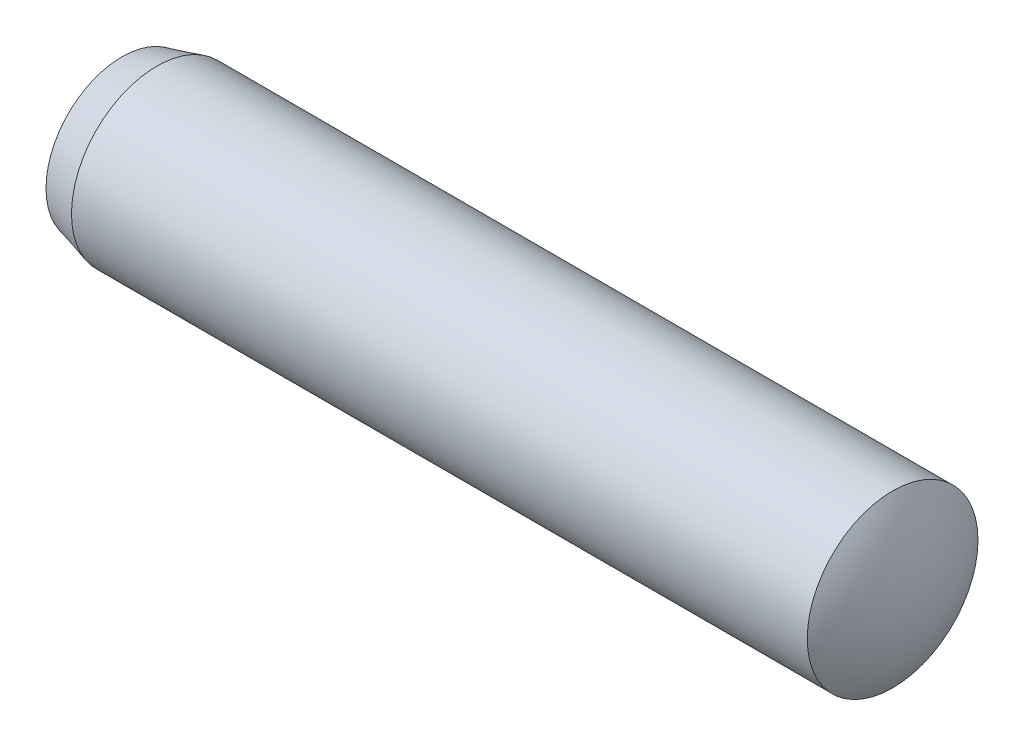
ISO-10303-21;
HEADER;
FILE_DESCRIPTION(('STEP AP214'),'2;1');
FILE_NAME('part.step','',(''),(''),'','','');
FILE_SCHEMA(('AUTOMOTIVE_DESIGN { 1 0 10303 214 1 1 1 1 }'));
ENDSEC;
DATA;
#1=APPLICATION_CONTEXT('core data for automotive mechanical design processes');
#2=APPLICATION_PROTOCOL_DEFINITION('international standard','automotive_design',2000,#1);
#3=PRODUCT_CONTEXT('',#1,'mechanical');
#4=PRODUCT('Part','Part','',(#3));
#5=PRODUCT_RELATED_PRODUCT_CATEGORY('part','',(#4));
#6=PRODUCT_DEFINITION_FORMATION('','',#4);
#7=PRODUCT_DEFINITION_CONTEXT('part definition',#1,'design');
#8=PRODUCT_DEFINITION('design','',#6,#7);
#9=PRODUCT_DEFINITION_SHAPE('','',#8);
#10=(LENGTH_UNIT() NAMED_UNIT(*) SI_UNIT(.MILLI.,.METRE.));
#11=(NAMED_UNIT(*) PLANE_ANGLE_UNIT() SI_UNIT($,.RADIAN.));
#12=(NAMED_UNIT(*) SI_UNIT($,.STERADIAN.) SOLID_ANGLE_UNIT());
#13=UNCERTAINTY_MEASURE_WITH_UNIT(LENGTH_MEASURE(1.E-05),#10,'distance_accuracy_value','');
#14=(GEOMETRIC_REPRESENTATION_CONTEXT(3) GLOBAL_UNCERTAINTY_ASSIGNED_CONTEXT((#13)) GLOBAL_UNIT_ASSIGNED_CONTEXT((#10,
#11,#12)) REPRESENTATION_CONTEXT('',''));
#15=CARTESIAN_POINT('',(0.,0.,0.));
#16=DIRECTION('',(0.,0.,1.));
#17=DIRECTION('',(1.,0.,0.));
#18=AXIS2_PLACEMENT_3D('',#15,#16,#17);
#19=CARTESIAN_POINT('',(-12.,0.,0.));
#20=DIRECTION('',(-1.,0.,0.));
#21=DIRECTION('',(0.,-1.,0.));
#22=AXIS2_PLACEMENT_3D('',#19,#20,#21);
#23=CYLINDRICAL_SURFACE('',#22,2.5);
#24=CARTESIAN_POINT('',(-10.3,0.,0.));
#25=DIRECTION('',(-1.,0.,0.));
#26=DIRECTION('',(0.,-1.,0.));
#27=AXIS2_PLACEMENT_3D('',#24,#25,#26);
#28=CIRCLE('',#27,2.5);
#29=CARTESIAN_POINT('',(-10.3,-2.5,0.));
#30=VERTEX_POINT('',#29);
#31=EDGE_CURVE('E10',#30,#30,#28,.T.);
#32=ORIENTED_EDGE('',*,*,#31,.F.);
#33=EDGE_LOOP('',(#32));
#34=FACE_BOUND('',#33,.T.);
#35=CARTESIAN_POINT('',(11.25,0.,0.));
#36=DIRECTION('',(-1.,0.,0.));
#37=DIRECTION('',(0.,-1.,0.));
#38=AXIS2_PLACEMENT_3D('',#35,#36,#37);
#39=CIRCLE('',#38,2.5);
#40=CARTESIAN_POINT('',(11.25,-2.49999999999999,0.));
#41=VERTEX_POINT('',#40);
#42=EDGE_CURVE('E53',#41,#41,#39,.T.);
#43=ORIENTED_EDGE('',*,*,#42,.T.);
#44=EDGE_LOOP('',(#43));
#45=FACE_BOUND('',#44,.T.);
#46=ADVANCED_FACE('F41',(#34,#45),#23,.T.);
#47=CARTESIAN_POINT('',(-10.3,0.,0.));
#48=DIRECTION('',(1.,0.,0.));
#49=DIRECTION('',(0.,1.,0.));
#50=AXIS2_PLACEMENT_3D('',#47,#48,#49);
#51=CONICAL_SURFACE('',#50,2.5,0.261799387799151);
#52=CARTESIAN_POINT('',(-11.32,0.,0.));
#53=DIRECTION('',(-1.,0.,0.));
#54=DIRECTION('',(0.,-1.,0.));
#55=AXIS2_PLACEMENT_3D('',#52,#53,#54);
#56=CIRCLE('',#55,2.22669182372025);
#57=CARTESIAN_POINT('',(-11.32,-2.22669182372025,0.));
#58=VERTEX_POINT('',#57);
#59=EDGE_CURVE('E48',#58,#58,#56,.T.);
#60=ORIENTED_EDGE('',*,*,#59,.F.);
#61=EDGE_LOOP('',(#60));
#62=FACE_BOUND('',#61,.T.);
#63=ORIENTED_EDGE('',*,*,#31,.T.);
#64=EDGE_LOOP('',(#63));
#65=FACE_BOUND('',#64,.T.);
#66=ADVANCED_FACE('F75',(#62,#65),#51,.T.);
#67=CARTESIAN_POINT('',(-8.01429670748337,0.,0.));
#68=DIRECTION('',(-1.,0.,0.));
#69=DIRECTION('',(0.,1.,0.));
#70=AXIS2_PLACEMENT_3D('',#67,#68,#69);
#71=SPHERICAL_SURFACE('',#70,3.98570329251663);
#72=ORIENTED_EDGE('',*,*,#59,.T.);
#73=EDGE_LOOP('',(#72));
#74=FACE_BOUND('',#73,.T.);
#75=ADVANCED_FACE('F70',(#74),#71,.T.);
#76=CARTESIAN_POINT('',(7.45833333333333,0.,0.));
#77=DIRECTION('',(-1.,0.,0.));
#78=DIRECTION('',(0.,1.,0.));
#79=AXIS2_PLACEMENT_3D('',#76,#77,#78);
#80=SPHERICAL_SURFACE('',#79,4.54166666666667);
#81=ORIENTED_EDGE('',*,*,#42,.F.);
#82=EDGE_LOOP('',(#81));
#83=FACE_BOUND('',#82,.T.);
#84=ADVANCED_FACE('F62',(#83),#80,.T.);
#85=CLOSED_SHELL('',(#46,#66,#75,#84));
#86=MANIFOLD_SOLID_BREP('B2',#85);
#87=ADVANCED_BREP_SHAPE_REPRESENTATION('',(#18,#86),#14);
#88=SHAPE_DEFINITION_REPRESENTATION(#9,#87);
ENDSEC;
END-ISO-10303-21;
